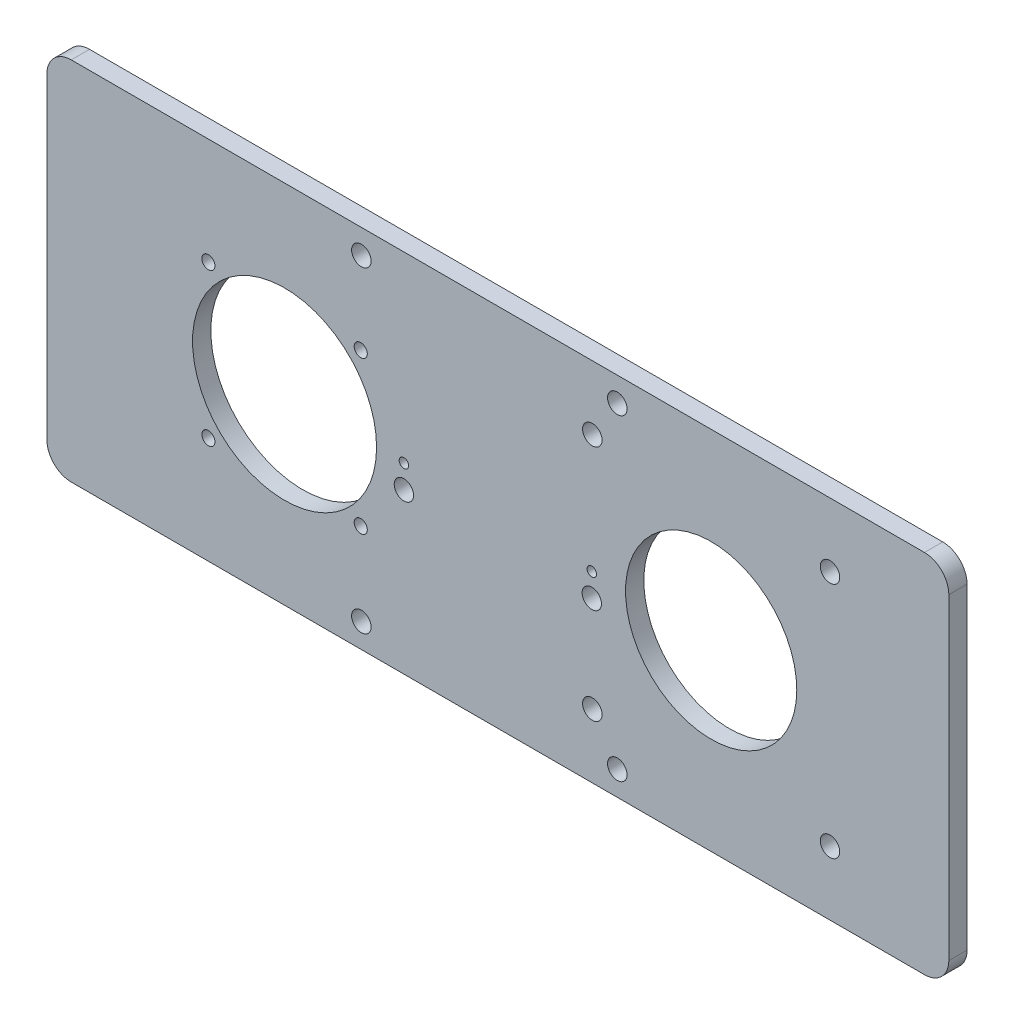
ISO-10303-21;
HEADER;
FILE_DESCRIPTION(('STEP AP214'),'2;1');
FILE_NAME('part.step','',(''),(''),'','','');
FILE_SCHEMA(('AUTOMOTIVE_DESIGN { 1 0 10303 214 1 1 1 1 }'));
ENDSEC;
DATA;
#1=APPLICATION_CONTEXT('core data for automotive mechanical design processes');
#2=APPLICATION_PROTOCOL_DEFINITION('international standard','automotive_design',2000,#1);
#3=PRODUCT_CONTEXT('',#1,'mechanical');
#4=PRODUCT('Part','Part','',(#3));
#5=PRODUCT_RELATED_PRODUCT_CATEGORY('part','',(#4));
#6=PRODUCT_DEFINITION_FORMATION('','',#4);
#7=PRODUCT_DEFINITION_CONTEXT('part definition',#1,'design');
#8=PRODUCT_DEFINITION('design','',#6,#7);
#9=PRODUCT_DEFINITION_SHAPE('','',#8);
#10=(LENGTH_UNIT() NAMED_UNIT(*) SI_UNIT(.MILLI.,.METRE.));
#11=(NAMED_UNIT(*) PLANE_ANGLE_UNIT() SI_UNIT($,.RADIAN.));
#12=(NAMED_UNIT(*) SI_UNIT($,.STERADIAN.) SOLID_ANGLE_UNIT());
#13=UNCERTAINTY_MEASURE_WITH_UNIT(LENGTH_MEASURE(1.E-05),#10,'distance_accuracy_value','');
#14=(GEOMETRIC_REPRESENTATION_CONTEXT(3) GLOBAL_UNCERTAINTY_ASSIGNED_CONTEXT((#13)) GLOBAL_UNIT_ASSIGNED_CONTEXT((#10,
#11,#12)) REPRESENTATION_CONTEXT('',''));
#15=CARTESIAN_POINT('',(0.,0.,0.));
#16=DIRECTION('',(0.,0.,1.));
#17=DIRECTION('',(1.,0.,0.));
#18=AXIS2_PLACEMENT_3D('',#15,#16,#17);
#19=CARTESIAN_POINT('',(-74.,30.,-3.));
#20=DIRECTION('',(-1.,0.,0.));
#21=DIRECTION('',(0.,0.,1.));
#22=AXIS2_PLACEMENT_3D('',#19,#20,#21);
#23=PLANE('',#22);
#24=DIRECTION('',(0.,-1.,0.));
#25=VECTOR('',#24,1.);
#26=CARTESIAN_POINT('',(-74.,30.,-3.));
#27=LINE('',#26,#25);
#28=CARTESIAN_POINT('',(-74.,26.,-3.));
#29=VERTEX_POINT('',#28);
#30=CARTESIAN_POINT('',(-74.,-26.,-3.));
#31=VERTEX_POINT('',#30);
#32=EDGE_CURVE('E171',#29,#31,#27,.T.);
#33=ORIENTED_EDGE('',*,*,#32,.T.);
#34=DIRECTION('',(0.,0.,1.));
#35=VECTOR('',#34,1.);
#36=CARTESIAN_POINT('',(-74.,-26.,-3.));
#37=LINE('',#36,#35);
#38=CARTESIAN_POINT('',(-74.,-26.,0.));
#39=VERTEX_POINT('',#38);
#40=EDGE_CURVE('E126',#31,#39,#37,.T.);
#41=ORIENTED_EDGE('',*,*,#40,.T.);
#42=DIRECTION('',(0.,-1.,0.));
#43=VECTOR('',#42,1.);
#44=CARTESIAN_POINT('',(-74.,30.,0.));
#45=LINE('',#44,#43);
#46=CARTESIAN_POINT('',(-74.,26.,0.));
#47=VERTEX_POINT('',#46);
#48=EDGE_CURVE('E111',#47,#39,#45,.T.);
#49=ORIENTED_EDGE('',*,*,#48,.F.);
#50=DIRECTION('',(0.,0.,1.));
#51=VECTOR('',#50,1.);
#52=CARTESIAN_POINT('',(-74.,26.,-3.));
#53=LINE('',#52,#51);
#54=EDGE_CURVE('E123',#47,#29,#53,.F.);
#55=ORIENTED_EDGE('',*,*,#54,.T.);
#56=EDGE_LOOP('',(#33,#41,#49,#55));
#57=FACE_BOUND('',#56,.T.);
#58=ADVANCED_FACE('F41',(#57),#23,.T.);
#59=CARTESIAN_POINT('',(-74.,30.,-3.));
#60=DIRECTION('',(0.,1.,0.));
#61=DIRECTION('',(0.,0.,1.));
#62=AXIS2_PLACEMENT_3D('',#59,#60,#61);
#63=PLANE('',#62);
#64=DIRECTION('',(-1.,0.,0.));
#65=VECTOR('',#64,1.);
#66=CARTESIAN_POINT('',(-74.,30.,-3.));
#67=LINE('',#66,#65);
#68=CARTESIAN_POINT('',(70.,30.,-3.));
#69=VERTEX_POINT('',#68);
#70=CARTESIAN_POINT('',(-70.,30.,-3.));
#71=VERTEX_POINT('',#70);
#72=EDGE_CURVE('E133',#69,#71,#67,.T.);
#73=ORIENTED_EDGE('',*,*,#72,.T.);
#74=DIRECTION('',(0.,0.,1.));
#75=VECTOR('',#74,1.);
#76=CARTESIAN_POINT('',(-70.,30.,-3.));
#77=LINE('',#76,#75);
#78=CARTESIAN_POINT('',(-70.,30.,0.));
#79=VERTEX_POINT('',#78);
#80=EDGE_CURVE('E11',#71,#79,#77,.T.);
#81=ORIENTED_EDGE('',*,*,#80,.T.);
#82=DIRECTION('',(-1.,0.,0.));
#83=VECTOR('',#82,1.);
#84=CARTESIAN_POINT('',(-74.,30.,0.));
#85=LINE('',#84,#83);
#86=CARTESIAN_POINT('',(70.,30.,0.));
#87=VERTEX_POINT('',#86);
#88=EDGE_CURVE('E113',#87,#79,#85,.T.);
#89=ORIENTED_EDGE('',*,*,#88,.F.);
#90=DIRECTION('',(0.,0.,1.));
#91=VECTOR('',#90,1.);
#92=CARTESIAN_POINT('',(70.,30.,-3.));
#93=LINE('',#92,#91);
#94=EDGE_CURVE('E49',#87,#69,#93,.F.);
#95=ORIENTED_EDGE('',*,*,#94,.T.);
#96=EDGE_LOOP('',(#73,#81,#89,#95));
#97=FACE_BOUND('',#96,.T.);
#98=ADVANCED_FACE('F162',(#97),#63,.T.);
#99=CARTESIAN_POINT('',(74.,-30.,-3.));
#100=DIRECTION('',(1.,0.,0.));
#101=DIRECTION('',(0.,0.,-1.));
#102=AXIS2_PLACEMENT_3D('',#99,#100,#101);
#103=PLANE('',#102);
#104=DIRECTION('',(0.,1.,0.));
#105=VECTOR('',#104,1.);
#106=CARTESIAN_POINT('',(74.,-30.,0.));
#107=LINE('',#106,#105);
#108=CARTESIAN_POINT('',(74.,-26.,0.));
#109=VERTEX_POINT('',#108);
#110=CARTESIAN_POINT('',(74.,26.,0.));
#111=VERTEX_POINT('',#110);
#112=EDGE_CURVE('E169',#109,#111,#107,.T.);
#113=ORIENTED_EDGE('',*,*,#112,.F.);
#114=DIRECTION('',(0.,0.,1.));
#115=VECTOR('',#114,1.);
#116=CARTESIAN_POINT('',(74.,-26.,-3.));
#117=LINE('',#116,#115);
#118=CARTESIAN_POINT('',(74.,-26.,-3.));
#119=VERTEX_POINT('',#118);
#120=EDGE_CURVE('E63',#109,#119,#117,.F.);
#121=ORIENTED_EDGE('',*,*,#120,.T.);
#122=DIRECTION('',(0.,1.,0.));
#123=VECTOR('',#122,1.);
#124=CARTESIAN_POINT('',(74.,-30.,-3.));
#125=LINE('',#124,#123);
#126=CARTESIAN_POINT('',(74.,26.,-3.));
#127=VERTEX_POINT('',#126);
#128=EDGE_CURVE('E137',#119,#127,#125,.T.);
#129=ORIENTED_EDGE('',*,*,#128,.T.);
#130=DIRECTION('',(0.,0.,1.));
#131=VECTOR('',#130,1.);
#132=CARTESIAN_POINT('',(74.,26.,-3.));
#133=LINE('',#132,#131);
#134=EDGE_CURVE('E157',#127,#111,#133,.T.);
#135=ORIENTED_EDGE('',*,*,#134,.T.);
#136=EDGE_LOOP('',(#113,#121,#129,#135));
#137=FACE_BOUND('',#136,.T.);
#138=ADVANCED_FACE('F168',(#137),#103,.T.);
#139=CARTESIAN_POINT('',(-74.,-30.,-3.));
#140=DIRECTION('',(0.,-1.,0.));
#141=DIRECTION('',(0.,0.,-1.));
#142=AXIS2_PLACEMENT_3D('',#139,#140,#141);
#143=PLANE('',#142);
#144=DIRECTION('',(1.,0.,0.));
#145=VECTOR('',#144,1.);
#146=CARTESIAN_POINT('',(-74.,-30.,0.));
#147=LINE('',#146,#145);
#148=CARTESIAN_POINT('',(-70.,-30.,0.));
#149=VERTEX_POINT('',#148);
#150=CARTESIAN_POINT('',(70.,-30.,0.));
#151=VERTEX_POINT('',#150);
#152=EDGE_CURVE('E127',#149,#151,#147,.T.);
#153=ORIENTED_EDGE('',*,*,#152,.F.);
#154=DIRECTION('',(0.,0.,1.));
#155=VECTOR('',#154,1.);
#156=CARTESIAN_POINT('',(-70.,-30.,-3.));
#157=LINE('',#156,#155);
#158=CARTESIAN_POINT('',(-70.,-30.,-3.));
#159=VERTEX_POINT('',#158);
#160=EDGE_CURVE('E149',#149,#159,#157,.F.);
#161=ORIENTED_EDGE('',*,*,#160,.T.);
#162=DIRECTION('',(1.,0.,0.));
#163=VECTOR('',#162,1.);
#164=CARTESIAN_POINT('',(-74.,-30.,-3.));
#165=LINE('',#164,#163);
#166=CARTESIAN_POINT('',(70.,-30.,-3.));
#167=VERTEX_POINT('',#166);
#168=EDGE_CURVE('E175',#159,#167,#165,.T.);
#169=ORIENTED_EDGE('',*,*,#168,.T.);
#170=DIRECTION('',(0.,0.,1.));
#171=VECTOR('',#170,1.);
#172=CARTESIAN_POINT('',(70.,-30.,-3.));
#173=LINE('',#172,#171);
#174=EDGE_CURVE('E146',#167,#151,#173,.T.);
#175=ORIENTED_EDGE('',*,*,#174,.T.);
#176=EDGE_LOOP('',(#153,#161,#169,#175));
#177=FACE_BOUND('',#176,.T.);
#178=ADVANCED_FACE('F347',(#177),#143,.T.);
#179=CARTESIAN_POINT('',(0.,0.,-3.));
#180=DIRECTION('',(0.,0.,1.));
#181=DIRECTION('',(1.,0.,0.));
#182=AXIS2_PLACEMENT_3D('',#179,#180,#181);
#183=PLANE('',#182);
#184=CARTESIAN_POINT('',(-22.4,26.,-3.));
#185=DIRECTION('',(0.,0.,1.));
#186=DIRECTION('',(1.,0.,0.));
#187=AXIS2_PLACEMENT_3D('',#184,#185,#186);
#188=CIRCLE('',#187,1.6);
#189=CARTESIAN_POINT('',(-20.8,26.,-3.));
#190=VERTEX_POINT('',#189);
#191=EDGE_CURVE('E280',#190,#190,#188,.T.);
#192=ORIENTED_EDGE('',*,*,#191,.T.);
#193=EDGE_LOOP('',(#192));
#194=FACE_BOUND('',#193,.T.);
#195=CARTESIAN_POINT('',(19.5999999999999,26.,-3.));
#196=DIRECTION('',(0.,0.,1.));
#197=DIRECTION('',(1.,0.,0.));
#198=AXIS2_PLACEMENT_3D('',#195,#196,#197);
#199=CIRCLE('',#198,1.6);
#200=CARTESIAN_POINT('',(21.1999999999999,26.,-3.));
#201=VERTEX_POINT('',#200);
#202=EDGE_CURVE('E274',#201,#201,#199,.T.);
#203=ORIENTED_EDGE('',*,*,#202,.T.);
#204=EDGE_LOOP('',(#203));
#205=FACE_BOUND('',#204,.T.);
#206=CARTESIAN_POINT('',(19.5999999999999,-26.,-3.));
#207=DIRECTION('',(0.,0.,1.));
#208=DIRECTION('',(1.,0.,0.));
#209=AXIS2_PLACEMENT_3D('',#206,#207,#208);
#210=CIRCLE('',#209,1.6);
#211=CARTESIAN_POINT('',(21.1999999999999,-26.,-3.));
#212=VERTEX_POINT('',#211);
#213=EDGE_CURVE('E268',#212,#212,#210,.T.);
#214=ORIENTED_EDGE('',*,*,#213,.T.);
#215=EDGE_LOOP('',(#214));
#216=FACE_BOUND('',#215,.T.);
#217=CARTESIAN_POINT('',(-22.4,-26.,-3.));
#218=DIRECTION('',(0.,0.,1.));
#219=DIRECTION('',(1.,0.,0.));
#220=AXIS2_PLACEMENT_3D('',#217,#218,#219);
#221=CIRCLE('',#220,1.6);
#222=CARTESIAN_POINT('',(-20.8,-26.,-3.));
#223=VERTEX_POINT('',#222);
#224=EDGE_CURVE('E262',#223,#223,#221,.T.);
#225=ORIENTED_EDGE('',*,*,#224,.T.);
#226=EDGE_LOOP('',(#225));
#227=FACE_BOUND('',#226,.T.);
#228=CARTESIAN_POINT('',(-15.42,0.,-3.));
#229=DIRECTION('',(0.,0.,1.));
#230=DIRECTION('',(1.,0.,0.));
#231=AXIS2_PLACEMENT_3D('',#228,#229,#230);
#232=CIRCLE('',#231,0.775);
#233=CARTESIAN_POINT('',(-14.645,0.,-3.));
#234=VERTEX_POINT('',#233);
#235=EDGE_CURVE('E256',#234,#234,#232,.T.);
#236=ORIENTED_EDGE('',*,*,#235,.T.);
#237=EDGE_LOOP('',(#236));
#238=FACE_BOUND('',#237,.T.);
#239=CARTESIAN_POINT('',(15.4159,0.,-3.));
#240=DIRECTION('',(0.,0.,1.));
#241=DIRECTION('',(1.,0.,0.));
#242=AXIS2_PLACEMENT_3D('',#239,#240,#241);
#243=CIRCLE('',#242,0.774999999999998);
#244=CARTESIAN_POINT('',(16.1909,0.,-3.));
#245=VERTEX_POINT('',#244);
#246=EDGE_CURVE('E250',#245,#245,#243,.T.);
#247=ORIENTED_EDGE('',*,*,#246,.T.);
#248=EDGE_LOOP('',(#247));
#249=FACE_BOUND('',#248,.T.);
#250=CARTESIAN_POINT('',(-15.42,-3.81,-3.));
#251=DIRECTION('',(0.,0.,1.));
#252=DIRECTION('',(1.,0.,0.));
#253=AXIS2_PLACEMENT_3D('',#250,#251,#252);
#254=CIRCLE('',#253,1.5875);
#255=CARTESIAN_POINT('',(-13.8325,-3.81,-3.));
#256=VERTEX_POINT('',#255);
#257=EDGE_CURVE('E244',#256,#256,#254,.T.);
#258=ORIENTED_EDGE('',*,*,#257,.T.);
#259=EDGE_LOOP('',(#258));
#260=FACE_BOUND('',#259,.T.);
#261=CARTESIAN_POINT('',(15.4159,-3.81,-3.));
#262=DIRECTION('',(0.,0.,1.));
#263=DIRECTION('',(1.,0.,0.));
#264=AXIS2_PLACEMENT_3D('',#261,#262,#263);
#265=CIRCLE('',#264,1.5875);
#266=CARTESIAN_POINT('',(17.0034,-3.81,-3.));
#267=VERTEX_POINT('',#266);
#268=EDGE_CURVE('E238',#267,#267,#265,.T.);
#269=ORIENTED_EDGE('',*,*,#268,.T.);
#270=EDGE_LOOP('',(#269));
#271=FACE_BOUND('',#270,.T.);
#272=CARTESIAN_POINT('',(15.5,19.5,-3.));
#273=DIRECTION('',(0.,0.,1.));
#274=DIRECTION('',(1.,0.,0.));
#275=AXIS2_PLACEMENT_3D('',#272,#273,#274);
#276=CIRCLE('',#275,1.6);
#277=CARTESIAN_POINT('',(17.1,19.5,-3.));
#278=VERTEX_POINT('',#277);
#279=EDGE_CURVE('E232',#278,#278,#276,.T.);
#280=ORIENTED_EDGE('',*,*,#279,.T.);
#281=EDGE_LOOP('',(#280));
#282=FACE_BOUND('',#281,.T.);
#283=CARTESIAN_POINT('',(54.5,19.5,-3.));
#284=DIRECTION('',(0.,0.,1.));
#285=DIRECTION('',(1.,0.,0.));
#286=AXIS2_PLACEMENT_3D('',#283,#284,#285);
#287=CIRCLE('',#286,1.6);
#288=CARTESIAN_POINT('',(56.1,19.5,-3.));
#289=VERTEX_POINT('',#288);
#290=EDGE_CURVE('E226',#289,#289,#287,.T.);
#291=ORIENTED_EDGE('',*,*,#290,.T.);
#292=EDGE_LOOP('',(#291));
#293=FACE_BOUND('',#292,.T.);
#294=CARTESIAN_POINT('',(54.5,-19.5,-3.));
#295=DIRECTION('',(0.,0.,1.));
#296=DIRECTION('',(1.,0.,0.));
#297=AXIS2_PLACEMENT_3D('',#294,#295,#296);
#298=CIRCLE('',#297,1.6);
#299=CARTESIAN_POINT('',(56.1,-19.5,-3.));
#300=VERTEX_POINT('',#299);
#301=EDGE_CURVE('E220',#300,#300,#298,.T.);
#302=ORIENTED_EDGE('',*,*,#301,.T.);
#303=EDGE_LOOP('',(#302));
#304=FACE_BOUND('',#303,.T.);
#305=CARTESIAN_POINT('',(15.5,-19.5,-3.));
#306=DIRECTION('',(0.,0.,1.));
#307=DIRECTION('',(1.,0.,0.));
#308=AXIS2_PLACEMENT_3D('',#305,#306,#307);
#309=CIRCLE('',#308,1.6);
#310=CARTESIAN_POINT('',(17.1,-19.5,-3.));
#311=VERTEX_POINT('',#310);
#312=EDGE_CURVE('E214',#311,#311,#309,.T.);
#313=ORIENTED_EDGE('',*,*,#312,.T.);
#314=EDGE_LOOP('',(#313));
#315=FACE_BOUND('',#314,.T.);
#316=CARTESIAN_POINT('',(-47.5,12.5,-3.));
#317=DIRECTION('',(0.,0.,1.));
#318=DIRECTION('',(1.,0.,0.));
#319=AXIS2_PLACEMENT_3D('',#316,#317,#318);
#320=CIRCLE('',#319,1.075);
#321=CARTESIAN_POINT('',(-46.425,12.5,-3.));
#322=VERTEX_POINT('',#321);
#323=EDGE_CURVE('E208',#322,#322,#320,.T.);
#324=ORIENTED_EDGE('',*,*,#323,.T.);
#325=EDGE_LOOP('',(#324));
#326=FACE_BOUND('',#325,.T.);
#327=CARTESIAN_POINT('',(-22.5,12.5,-3.));
#328=DIRECTION('',(0.,0.,1.));
#329=DIRECTION('',(1.,0.,0.));
#330=AXIS2_PLACEMENT_3D('',#327,#328,#329);
#331=CIRCLE('',#330,1.075);
#332=CARTESIAN_POINT('',(-21.425,12.5,-3.));
#333=VERTEX_POINT('',#332);
#334=EDGE_CURVE('E202',#333,#333,#331,.T.);
#335=ORIENTED_EDGE('',*,*,#334,.T.);
#336=EDGE_LOOP('',(#335));
#337=FACE_BOUND('',#336,.T.);
#338=CARTESIAN_POINT('',(-22.5,-12.5,-3.));
#339=DIRECTION('',(0.,0.,1.));
#340=DIRECTION('',(1.,0.,0.));
#341=AXIS2_PLACEMENT_3D('',#338,#339,#340);
#342=CIRCLE('',#341,1.075);
#343=CARTESIAN_POINT('',(-21.425,-12.5,-3.));
#344=VERTEX_POINT('',#343);
#345=EDGE_CURVE('E196',#344,#344,#342,.T.);
#346=ORIENTED_EDGE('',*,*,#345,.T.);
#347=EDGE_LOOP('',(#346));
#348=FACE_BOUND('',#347,.T.);
#349=CARTESIAN_POINT('',(-47.5,-12.5,-3.));
#350=DIRECTION('',(0.,0.,1.));
#351=DIRECTION('',(1.,0.,0.));
#352=AXIS2_PLACEMENT_3D('',#349,#350,#351);
#353=CIRCLE('',#352,1.075);
#354=CARTESIAN_POINT('',(-46.425,-12.5,-3.));
#355=VERTEX_POINT('',#354);
#356=EDGE_CURVE('E188',#355,#355,#353,.T.);
#357=ORIENTED_EDGE('',*,*,#356,.T.);
#358=EDGE_LOOP('',(#357));
#359=FACE_BOUND('',#358,.T.);
#360=CARTESIAN_POINT('',(-35.,0.,-3.));
#361=DIRECTION('',(0.,0.,1.));
#362=DIRECTION('',(1.,0.,0.));
#363=AXIS2_PLACEMENT_3D('',#360,#361,#362);
#364=CIRCLE('',#363,15.1);
#365=CARTESIAN_POINT('',(-19.9,0.,-3.));
#366=VERTEX_POINT('',#365);
#367=EDGE_CURVE('E182',#366,#366,#364,.T.);
#368=ORIENTED_EDGE('',*,*,#367,.T.);
#369=EDGE_LOOP('',(#368));
#370=FACE_BOUND('',#369,.T.);
#371=CARTESIAN_POINT('',(35.,0.,-3.));
#372=DIRECTION('',(0.,0.,1.));
#373=DIRECTION('',(1.,0.,0.));
#374=AXIS2_PLACEMENT_3D('',#371,#372,#373);
#375=CIRCLE('',#374,14.05);
#376=CARTESIAN_POINT('',(49.05,0.,-3.));
#377=VERTEX_POINT('',#376);
#378=EDGE_CURVE('E128',#377,#377,#375,.T.);
#379=ORIENTED_EDGE('',*,*,#378,.T.);
#380=EDGE_LOOP('',(#379));
#381=FACE_BOUND('',#380,.T.);
#382=ORIENTED_EDGE('',*,*,#168,.F.);
#383=CARTESIAN_POINT('',(-70.,-26.,-3.));
#384=DIRECTION('',(0.,0.,1.));
#385=DIRECTION('',(1.,0.,0.));
#386=AXIS2_PLACEMENT_3D('',#383,#384,#385);
#387=CIRCLE('',#386,4.);
#388=EDGE_CURVE('E155',#159,#31,#387,.F.);
#389=ORIENTED_EDGE('',*,*,#388,.T.);
#390=ORIENTED_EDGE('',*,*,#32,.F.);
#391=CARTESIAN_POINT('',(-70.,26.,-3.));
#392=DIRECTION('',(0.,0.,1.));
#393=DIRECTION('',(1.,0.,0.));
#394=AXIS2_PLACEMENT_3D('',#391,#392,#393);
#395=CIRCLE('',#394,4.);
#396=EDGE_CURVE('E132',#29,#71,#395,.F.);
#397=ORIENTED_EDGE('',*,*,#396,.T.);
#398=ORIENTED_EDGE('',*,*,#72,.F.);
#399=CARTESIAN_POINT('',(70.,26.,-3.));
#400=DIRECTION('',(0.,0.,1.));
#401=DIRECTION('',(1.,0.,0.));
#402=AXIS2_PLACEMENT_3D('',#399,#400,#401);
#403=CIRCLE('',#402,4.);
#404=EDGE_CURVE('E56',#69,#127,#403,.F.);
#405=ORIENTED_EDGE('',*,*,#404,.T.);
#406=ORIENTED_EDGE('',*,*,#128,.F.);
#407=CARTESIAN_POINT('',(70.,-26.,-3.));
#408=DIRECTION('',(0.,0.,1.));
#409=DIRECTION('',(1.,0.,0.));
#410=AXIS2_PLACEMENT_3D('',#407,#408,#409);
#411=CIRCLE('',#410,4.);
#412=EDGE_CURVE('E153',#119,#167,#411,.F.);
#413=ORIENTED_EDGE('',*,*,#412,.T.);
#414=EDGE_LOOP('',(#382,#389,#390,#397,#398,#405,#406,#413));
#415=FACE_BOUND('',#414,.T.);
#416=ADVANCED_FACE('F165',(#194,#205,#216,#227,#238,#249,#260,#271,#282,#293,#304,#315,#326,
#337,#348,#359,#370,#381,#415),#183,.F.);
#417=CARTESIAN_POINT('',(0.,0.,0.));
#418=DIRECTION('',(0.,0.,1.));
#419=DIRECTION('',(1.,0.,0.));
#420=AXIS2_PLACEMENT_3D('',#417,#418,#419);
#421=PLANE('',#420);
#422=CARTESIAN_POINT('',(-22.4,26.,0.));
#423=DIRECTION('',(0.,0.,1.));
#424=DIRECTION('',(1.,0.,0.));
#425=AXIS2_PLACEMENT_3D('',#422,#423,#424);
#426=CIRCLE('',#425,1.6);
#427=CARTESIAN_POINT('',(-20.8,26.,0.));
#428=VERTEX_POINT('',#427);
#429=EDGE_CURVE('E283',#428,#428,#426,.T.);
#430=ORIENTED_EDGE('',*,*,#429,.F.);
#431=EDGE_LOOP('',(#430));
#432=FACE_BOUND('',#431,.T.);
#433=CARTESIAN_POINT('',(19.5999999999999,26.,0.));
#434=DIRECTION('',(0.,0.,1.));
#435=DIRECTION('',(1.,0.,0.));
#436=AXIS2_PLACEMENT_3D('',#433,#434,#435);
#437=CIRCLE('',#436,1.6);
#438=CARTESIAN_POINT('',(21.1999999999999,26.,0.));
#439=VERTEX_POINT('',#438);
#440=EDGE_CURVE('E277',#439,#439,#437,.T.);
#441=ORIENTED_EDGE('',*,*,#440,.F.);
#442=EDGE_LOOP('',(#441));
#443=FACE_BOUND('',#442,.T.);
#444=CARTESIAN_POINT('',(19.5999999999999,-26.,0.));
#445=DIRECTION('',(0.,0.,1.));
#446=DIRECTION('',(1.,0.,0.));
#447=AXIS2_PLACEMENT_3D('',#444,#445,#446);
#448=CIRCLE('',#447,1.6);
#449=CARTESIAN_POINT('',(21.1999999999999,-26.,0.));
#450=VERTEX_POINT('',#449);
#451=EDGE_CURVE('E271',#450,#450,#448,.T.);
#452=ORIENTED_EDGE('',*,*,#451,.F.);
#453=EDGE_LOOP('',(#452));
#454=FACE_BOUND('',#453,.T.);
#455=CARTESIAN_POINT('',(-22.4,-26.,0.));
#456=DIRECTION('',(0.,0.,1.));
#457=DIRECTION('',(1.,0.,0.));
#458=AXIS2_PLACEMENT_3D('',#455,#456,#457);
#459=CIRCLE('',#458,1.6);
#460=CARTESIAN_POINT('',(-20.8,-26.,0.));
#461=VERTEX_POINT('',#460);
#462=EDGE_CURVE('E265',#461,#461,#459,.T.);
#463=ORIENTED_EDGE('',*,*,#462,.F.);
#464=EDGE_LOOP('',(#463));
#465=FACE_BOUND('',#464,.T.);
#466=CARTESIAN_POINT('',(-15.42,0.,0.));
#467=DIRECTION('',(0.,0.,1.));
#468=DIRECTION('',(1.,0.,0.));
#469=AXIS2_PLACEMENT_3D('',#466,#467,#468);
#470=CIRCLE('',#469,0.775);
#471=CARTESIAN_POINT('',(-14.645,0.,0.));
#472=VERTEX_POINT('',#471);
#473=EDGE_CURVE('E259',#472,#472,#470,.T.);
#474=ORIENTED_EDGE('',*,*,#473,.F.);
#475=EDGE_LOOP('',(#474));
#476=FACE_BOUND('',#475,.T.);
#477=CARTESIAN_POINT('',(15.4159,0.,0.));
#478=DIRECTION('',(0.,0.,1.));
#479=DIRECTION('',(1.,0.,0.));
#480=AXIS2_PLACEMENT_3D('',#477,#478,#479);
#481=CIRCLE('',#480,0.774999999999998);
#482=CARTESIAN_POINT('',(16.1909,0.,0.));
#483=VERTEX_POINT('',#482);
#484=EDGE_CURVE('E253',#483,#483,#481,.T.);
#485=ORIENTED_EDGE('',*,*,#484,.F.);
#486=EDGE_LOOP('',(#485));
#487=FACE_BOUND('',#486,.T.);
#488=CARTESIAN_POINT('',(-15.42,-3.81,0.));
#489=DIRECTION('',(0.,0.,1.));
#490=DIRECTION('',(1.,0.,0.));
#491=AXIS2_PLACEMENT_3D('',#488,#489,#490);
#492=CIRCLE('',#491,1.5875);
#493=CARTESIAN_POINT('',(-13.8325,-3.81,0.));
#494=VERTEX_POINT('',#493);
#495=EDGE_CURVE('E247',#494,#494,#492,.T.);
#496=ORIENTED_EDGE('',*,*,#495,.F.);
#497=EDGE_LOOP('',(#496));
#498=FACE_BOUND('',#497,.T.);
#499=CARTESIAN_POINT('',(15.4159,-3.81,0.));
#500=DIRECTION('',(0.,0.,1.));
#501=DIRECTION('',(1.,0.,0.));
#502=AXIS2_PLACEMENT_3D('',#499,#500,#501);
#503=CIRCLE('',#502,1.5875);
#504=CARTESIAN_POINT('',(17.0034,-3.81,0.));
#505=VERTEX_POINT('',#504);
#506=EDGE_CURVE('E241',#505,#505,#503,.T.);
#507=ORIENTED_EDGE('',*,*,#506,.F.);
#508=EDGE_LOOP('',(#507));
#509=FACE_BOUND('',#508,.T.);
#510=CARTESIAN_POINT('',(15.5,19.5,0.));
#511=DIRECTION('',(0.,0.,1.));
#512=DIRECTION('',(1.,0.,0.));
#513=AXIS2_PLACEMENT_3D('',#510,#511,#512);
#514=CIRCLE('',#513,1.6);
#515=CARTESIAN_POINT('',(17.1,19.5,0.));
#516=VERTEX_POINT('',#515);
#517=EDGE_CURVE('E235',#516,#516,#514,.T.);
#518=ORIENTED_EDGE('',*,*,#517,.F.);
#519=EDGE_LOOP('',(#518));
#520=FACE_BOUND('',#519,.T.);
#521=CARTESIAN_POINT('',(54.5,19.5,0.));
#522=DIRECTION('',(0.,0.,1.));
#523=DIRECTION('',(1.,0.,0.));
#524=AXIS2_PLACEMENT_3D('',#521,#522,#523);
#525=CIRCLE('',#524,1.6);
#526=CARTESIAN_POINT('',(56.1,19.5,0.));
#527=VERTEX_POINT('',#526);
#528=EDGE_CURVE('E229',#527,#527,#525,.T.);
#529=ORIENTED_EDGE('',*,*,#528,.F.);
#530=EDGE_LOOP('',(#529));
#531=FACE_BOUND('',#530,.T.);
#532=CARTESIAN_POINT('',(54.5,-19.5,0.));
#533=DIRECTION('',(0.,0.,1.));
#534=DIRECTION('',(1.,0.,0.));
#535=AXIS2_PLACEMENT_3D('',#532,#533,#534);
#536=CIRCLE('',#535,1.6);
#537=CARTESIAN_POINT('',(56.1,-19.5,0.));
#538=VERTEX_POINT('',#537);
#539=EDGE_CURVE('E223',#538,#538,#536,.T.);
#540=ORIENTED_EDGE('',*,*,#539,.F.);
#541=EDGE_LOOP('',(#540));
#542=FACE_BOUND('',#541,.T.);
#543=CARTESIAN_POINT('',(15.5,-19.5,0.));
#544=DIRECTION('',(0.,0.,1.));
#545=DIRECTION('',(1.,0.,0.));
#546=AXIS2_PLACEMENT_3D('',#543,#544,#545);
#547=CIRCLE('',#546,1.6);
#548=CARTESIAN_POINT('',(17.1,-19.5,0.));
#549=VERTEX_POINT('',#548);
#550=EDGE_CURVE('E217',#549,#549,#547,.T.);
#551=ORIENTED_EDGE('',*,*,#550,.F.);
#552=EDGE_LOOP('',(#551));
#553=FACE_BOUND('',#552,.T.);
#554=CARTESIAN_POINT('',(-47.5,12.5,0.));
#555=DIRECTION('',(0.,0.,1.));
#556=DIRECTION('',(1.,0.,0.));
#557=AXIS2_PLACEMENT_3D('',#554,#555,#556);
#558=CIRCLE('',#557,1.075);
#559=CARTESIAN_POINT('',(-46.425,12.5,0.));
#560=VERTEX_POINT('',#559);
#561=EDGE_CURVE('E211',#560,#560,#558,.T.);
#562=ORIENTED_EDGE('',*,*,#561,.F.);
#563=EDGE_LOOP('',(#562));
#564=FACE_BOUND('',#563,.T.);
#565=CARTESIAN_POINT('',(-22.5,12.5,0.));
#566=DIRECTION('',(0.,0.,1.));
#567=DIRECTION('',(1.,0.,0.));
#568=AXIS2_PLACEMENT_3D('',#565,#566,#567);
#569=CIRCLE('',#568,1.075);
#570=CARTESIAN_POINT('',(-21.425,12.5,0.));
#571=VERTEX_POINT('',#570);
#572=EDGE_CURVE('E205',#571,#571,#569,.T.);
#573=ORIENTED_EDGE('',*,*,#572,.F.);
#574=EDGE_LOOP('',(#573));
#575=FACE_BOUND('',#574,.T.);
#576=CARTESIAN_POINT('',(-22.5,-12.5,0.));
#577=DIRECTION('',(0.,0.,1.));
#578=DIRECTION('',(1.,0.,0.));
#579=AXIS2_PLACEMENT_3D('',#576,#577,#578);
#580=CIRCLE('',#579,1.075);
#581=CARTESIAN_POINT('',(-21.425,-12.5,0.));
#582=VERTEX_POINT('',#581);
#583=EDGE_CURVE('E199',#582,#582,#580,.T.);
#584=ORIENTED_EDGE('',*,*,#583,.F.);
#585=EDGE_LOOP('',(#584));
#586=FACE_BOUND('',#585,.T.);
#587=CARTESIAN_POINT('',(-47.5,-12.5,0.));
#588=DIRECTION('',(0.,0.,1.));
#589=DIRECTION('',(1.,0.,0.));
#590=AXIS2_PLACEMENT_3D('',#587,#588,#589);
#591=CIRCLE('',#590,1.075);
#592=CARTESIAN_POINT('',(-46.425,-12.5,0.));
#593=VERTEX_POINT('',#592);
#594=EDGE_CURVE('E193',#593,#593,#591,.T.);
#595=ORIENTED_EDGE('',*,*,#594,.F.);
#596=EDGE_LOOP('',(#595));
#597=FACE_BOUND('',#596,.T.);
#598=CARTESIAN_POINT('',(-35.,0.,0.));
#599=DIRECTION('',(0.,0.,1.));
#600=DIRECTION('',(1.,0.,0.));
#601=AXIS2_PLACEMENT_3D('',#598,#599,#600);
#602=CIRCLE('',#601,15.1);
#603=CARTESIAN_POINT('',(-19.9,0.,0.));
#604=VERTEX_POINT('',#603);
#605=EDGE_CURVE('E185',#604,#604,#602,.T.);
#606=ORIENTED_EDGE('',*,*,#605,.F.);
#607=EDGE_LOOP('',(#606));
#608=FACE_BOUND('',#607,.T.);
#609=CARTESIAN_POINT('',(35.,0.,0.));
#610=DIRECTION('',(0.,0.,1.));
#611=DIRECTION('',(1.,0.,0.));
#612=AXIS2_PLACEMENT_3D('',#609,#610,#611);
#613=CIRCLE('',#612,14.05);
#614=CARTESIAN_POINT('',(49.05,0.,0.));
#615=VERTEX_POINT('',#614);
#616=EDGE_CURVE('E179',#615,#615,#613,.T.);
#617=ORIENTED_EDGE('',*,*,#616,.F.);
#618=EDGE_LOOP('',(#617));
#619=FACE_BOUND('',#618,.T.);
#620=ORIENTED_EDGE('',*,*,#48,.T.);
#621=CARTESIAN_POINT('',(-70.,-26.,0.));
#622=DIRECTION('',(0.,0.,1.));
#623=DIRECTION('',(1.,0.,0.));
#624=AXIS2_PLACEMENT_3D('',#621,#622,#623);
#625=CIRCLE('',#624,4.);
#626=EDGE_CURVE('E144',#39,#149,#625,.T.);
#627=ORIENTED_EDGE('',*,*,#626,.T.);
#628=ORIENTED_EDGE('',*,*,#152,.T.);
#629=CARTESIAN_POINT('',(70.,-26.,0.));
#630=DIRECTION('',(0.,0.,1.));
#631=DIRECTION('',(1.,0.,0.));
#632=AXIS2_PLACEMENT_3D('',#629,#630,#631);
#633=CIRCLE('',#632,4.);
#634=EDGE_CURVE('E117',#151,#109,#633,.T.);
#635=ORIENTED_EDGE('',*,*,#634,.T.);
#636=ORIENTED_EDGE('',*,*,#112,.T.);
#637=CARTESIAN_POINT('',(70.,26.,0.));
#638=DIRECTION('',(0.,0.,1.));
#639=DIRECTION('',(1.,0.,0.));
#640=AXIS2_PLACEMENT_3D('',#637,#638,#639);
#641=CIRCLE('',#640,4.);
#642=EDGE_CURVE('E118',#111,#87,#641,.T.);
#643=ORIENTED_EDGE('',*,*,#642,.T.);
#644=ORIENTED_EDGE('',*,*,#88,.T.);
#645=CARTESIAN_POINT('',(-70.,26.,0.));
#646=DIRECTION('',(0.,0.,1.));
#647=DIRECTION('',(1.,0.,0.));
#648=AXIS2_PLACEMENT_3D('',#645,#646,#647);
#649=CIRCLE('',#648,4.);
#650=EDGE_CURVE('E108',#79,#47,#649,.T.);
#651=ORIENTED_EDGE('',*,*,#650,.T.);
#652=EDGE_LOOP('',(#620,#627,#628,#635,#636,#643,#644,#651));
#653=FACE_BOUND('',#652,.T.);
#654=ADVANCED_FACE('F110',(#432,#443,#454,#465,#476,#487,#498,#509,#520,#531,#542,#553,#564,
#575,#586,#597,#608,#619,#653),#421,.T.);
#655=CARTESIAN_POINT('',(35.,0.,-3.));
#656=DIRECTION('',(0.,0.,1.));
#657=DIRECTION('',(1.,0.,0.));
#658=AXIS2_PLACEMENT_3D('',#655,#656,#657);
#659=CYLINDRICAL_SURFACE('',#658,14.05);
#660=ORIENTED_EDGE('',*,*,#378,.F.);
#661=EDGE_LOOP('',(#660));
#662=FACE_BOUND('',#661,.T.);
#663=ORIENTED_EDGE('',*,*,#616,.T.);
#664=EDGE_LOOP('',(#663));
#665=FACE_BOUND('',#664,.T.);
#666=ADVANCED_FACE('F291',(#662,#665),#659,.F.);
#667=CARTESIAN_POINT('',(-35.,0.,-3.));
#668=DIRECTION('',(0.,0.,1.));
#669=DIRECTION('',(1.,0.,0.));
#670=AXIS2_PLACEMENT_3D('',#667,#668,#669);
#671=CYLINDRICAL_SURFACE('',#670,15.1);
#672=ORIENTED_EDGE('',*,*,#367,.F.);
#673=EDGE_LOOP('',(#672));
#674=FACE_BOUND('',#673,.T.);
#675=ORIENTED_EDGE('',*,*,#605,.T.);
#676=EDGE_LOOP('',(#675));
#677=FACE_BOUND('',#676,.T.);
#678=ADVANCED_FACE('F328',(#674,#677),#671,.F.);
#679=CARTESIAN_POINT('',(-70.,-26.,-3.));
#680=DIRECTION('',(0.,0.,1.));
#681=DIRECTION('',(1.,0.,0.));
#682=AXIS2_PLACEMENT_3D('',#679,#680,#681);
#683=CYLINDRICAL_SURFACE('',#682,4.);
#684=ORIENTED_EDGE('',*,*,#388,.F.);
#685=ORIENTED_EDGE('',*,*,#160,.F.);
#686=ORIENTED_EDGE('',*,*,#626,.F.);
#687=ORIENTED_EDGE('',*,*,#40,.F.);
#688=EDGE_LOOP('',(#684,#685,#686,#687));
#689=FACE_BOUND('',#688,.T.);
#690=ADVANCED_FACE('F334',(#689),#683,.T.);
#691=CARTESIAN_POINT('',(70.,-26.,-3.));
#692=DIRECTION('',(0.,0.,1.));
#693=DIRECTION('',(1.,0.,0.));
#694=AXIS2_PLACEMENT_3D('',#691,#692,#693);
#695=CYLINDRICAL_SURFACE('',#694,4.);
#696=ORIENTED_EDGE('',*,*,#412,.F.);
#697=ORIENTED_EDGE('',*,*,#120,.F.);
#698=ORIENTED_EDGE('',*,*,#634,.F.);
#699=ORIENTED_EDGE('',*,*,#174,.F.);
#700=EDGE_LOOP('',(#696,#697,#698,#699));
#701=FACE_BOUND('',#700,.T.);
#702=ADVANCED_FACE('F351',(#701),#695,.T.);
#703=CARTESIAN_POINT('',(-70.,26.,-3.));
#704=DIRECTION('',(0.,0.,1.));
#705=DIRECTION('',(1.,0.,0.));
#706=AXIS2_PLACEMENT_3D('',#703,#704,#705);
#707=CYLINDRICAL_SURFACE('',#706,4.);
#708=ORIENTED_EDGE('',*,*,#396,.F.);
#709=ORIENTED_EDGE('',*,*,#54,.F.);
#710=ORIENTED_EDGE('',*,*,#650,.F.);
#711=ORIENTED_EDGE('',*,*,#80,.F.);
#712=EDGE_LOOP('',(#708,#709,#710,#711));
#713=FACE_BOUND('',#712,.T.);
#714=ADVANCED_FACE('F131',(#713),#707,.T.);
#715=CARTESIAN_POINT('',(70.,26.,-3.));
#716=DIRECTION('',(0.,0.,1.));
#717=DIRECTION('',(1.,0.,0.));
#718=AXIS2_PLACEMENT_3D('',#715,#716,#717);
#719=CYLINDRICAL_SURFACE('',#718,4.);
#720=ORIENTED_EDGE('',*,*,#404,.F.);
#721=ORIENTED_EDGE('',*,*,#94,.F.);
#722=ORIENTED_EDGE('',*,*,#642,.F.);
#723=ORIENTED_EDGE('',*,*,#134,.F.);
#724=EDGE_LOOP('',(#720,#721,#722,#723));
#725=FACE_BOUND('',#724,.T.);
#726=ADVANCED_FACE('F43',(#725),#719,.T.);
#727=CARTESIAN_POINT('',(-47.5,-12.5,0.));
#728=DIRECTION('',(0.,0.,1.));
#729=DIRECTION('',(1.,0.,0.));
#730=AXIS2_PLACEMENT_3D('',#727,#728,#729);
#731=CYLINDRICAL_SURFACE('',#730,1.075);
#732=ORIENTED_EDGE('',*,*,#356,.F.);
#733=EDGE_LOOP('',(#732));
#734=FACE_BOUND('',#733,.T.);
#735=ORIENTED_EDGE('',*,*,#594,.T.);
#736=EDGE_LOOP('',(#735));
#737=FACE_BOUND('',#736,.T.);
#738=ADVANCED_FACE('F359',(#734,#737),#731,.F.);
#739=CARTESIAN_POINT('',(-22.5,-12.5,0.));
#740=DIRECTION('',(0.,0.,1.));
#741=DIRECTION('',(1.,0.,0.));
#742=AXIS2_PLACEMENT_3D('',#739,#740,#741);
#743=CYLINDRICAL_SURFACE('',#742,1.075);
#744=ORIENTED_EDGE('',*,*,#345,.F.);
#745=EDGE_LOOP('',(#744));
#746=FACE_BOUND('',#745,.T.);
#747=ORIENTED_EDGE('',*,*,#583,.T.);
#748=EDGE_LOOP('',(#747));
#749=FACE_BOUND('',#748,.T.);
#750=ADVANCED_FACE('F363',(#746,#749),#743,.F.);
#751=CARTESIAN_POINT('',(-22.5,12.5,0.));
#752=DIRECTION('',(0.,0.,1.));
#753=DIRECTION('',(1.,0.,0.));
#754=AXIS2_PLACEMENT_3D('',#751,#752,#753);
#755=CYLINDRICAL_SURFACE('',#754,1.075);
#756=ORIENTED_EDGE('',*,*,#334,.F.);
#757=EDGE_LOOP('',(#756));
#758=FACE_BOUND('',#757,.T.);
#759=ORIENTED_EDGE('',*,*,#572,.T.);
#760=EDGE_LOOP('',(#759));
#761=FACE_BOUND('',#760,.T.);
#762=ADVANCED_FACE('F369',(#758,#761),#755,.F.);
#763=CARTESIAN_POINT('',(-47.5,12.5,0.));
#764=DIRECTION('',(0.,0.,1.));
#765=DIRECTION('',(1.,0.,0.));
#766=AXIS2_PLACEMENT_3D('',#763,#764,#765);
#767=CYLINDRICAL_SURFACE('',#766,1.075);
#768=ORIENTED_EDGE('',*,*,#323,.F.);
#769=EDGE_LOOP('',(#768));
#770=FACE_BOUND('',#769,.T.);
#771=ORIENTED_EDGE('',*,*,#561,.T.);
#772=EDGE_LOOP('',(#771));
#773=FACE_BOUND('',#772,.T.);
#774=ADVANCED_FACE('F377',(#770,#773),#767,.F.);
#775=CARTESIAN_POINT('',(15.5,-19.5,0.));
#776=DIRECTION('',(0.,0.,1.));
#777=DIRECTION('',(1.,0.,0.));
#778=AXIS2_PLACEMENT_3D('',#775,#776,#777);
#779=CYLINDRICAL_SURFACE('',#778,1.6);
#780=ORIENTED_EDGE('',*,*,#312,.F.);
#781=EDGE_LOOP('',(#780));
#782=FACE_BOUND('',#781,.T.);
#783=ORIENTED_EDGE('',*,*,#550,.T.);
#784=EDGE_LOOP('',(#783));
#785=FACE_BOUND('',#784,.T.);
#786=ADVANCED_FACE('F381',(#782,#785),#779,.F.);
#787=CARTESIAN_POINT('',(54.5,-19.5,0.));
#788=DIRECTION('',(0.,0.,1.));
#789=DIRECTION('',(1.,0.,0.));
#790=AXIS2_PLACEMENT_3D('',#787,#788,#789);
#791=CYLINDRICAL_SURFACE('',#790,1.6);
#792=ORIENTED_EDGE('',*,*,#301,.F.);
#793=EDGE_LOOP('',(#792));
#794=FACE_BOUND('',#793,.T.);
#795=ORIENTED_EDGE('',*,*,#539,.T.);
#796=EDGE_LOOP('',(#795));
#797=FACE_BOUND('',#796,.T.);
#798=ADVANCED_FACE('F385',(#794,#797),#791,.F.);
#799=CARTESIAN_POINT('',(54.5,19.5,0.));
#800=DIRECTION('',(0.,0.,1.));
#801=DIRECTION('',(1.,0.,0.));
#802=AXIS2_PLACEMENT_3D('',#799,#800,#801);
#803=CYLINDRICAL_SURFACE('',#802,1.6);
#804=ORIENTED_EDGE('',*,*,#290,.F.);
#805=EDGE_LOOP('',(#804));
#806=FACE_BOUND('',#805,.T.);
#807=ORIENTED_EDGE('',*,*,#528,.T.);
#808=EDGE_LOOP('',(#807));
#809=FACE_BOUND('',#808,.T.);
#810=ADVANCED_FACE('F389',(#806,#809),#803,.F.);
#811=CARTESIAN_POINT('',(15.5,19.5,0.));
#812=DIRECTION('',(0.,0.,1.));
#813=DIRECTION('',(1.,0.,0.));
#814=AXIS2_PLACEMENT_3D('',#811,#812,#813);
#815=CYLINDRICAL_SURFACE('',#814,1.6);
#816=ORIENTED_EDGE('',*,*,#279,.F.);
#817=EDGE_LOOP('',(#816));
#818=FACE_BOUND('',#817,.T.);
#819=ORIENTED_EDGE('',*,*,#517,.T.);
#820=EDGE_LOOP('',(#819));
#821=FACE_BOUND('',#820,.T.);
#822=ADVANCED_FACE('F393',(#818,#821),#815,.F.);
#823=CARTESIAN_POINT('',(15.4159,-3.81,0.));
#824=DIRECTION('',(0.,0.,1.));
#825=DIRECTION('',(1.,0.,0.));
#826=AXIS2_PLACEMENT_3D('',#823,#824,#825);
#827=CYLINDRICAL_SURFACE('',#826,1.5875);
#828=ORIENTED_EDGE('',*,*,#268,.F.);
#829=EDGE_LOOP('',(#828));
#830=FACE_BOUND('',#829,.T.);
#831=ORIENTED_EDGE('',*,*,#506,.T.);
#832=EDGE_LOOP('',(#831));
#833=FACE_BOUND('',#832,.T.);
#834=ADVANCED_FACE('F397',(#830,#833),#827,.F.);
#835=CARTESIAN_POINT('',(-15.42,-3.81,0.));
#836=DIRECTION('',(0.,0.,1.));
#837=DIRECTION('',(1.,0.,0.));
#838=AXIS2_PLACEMENT_3D('',#835,#836,#837);
#839=CYLINDRICAL_SURFACE('',#838,1.5875);
#840=ORIENTED_EDGE('',*,*,#257,.F.);
#841=EDGE_LOOP('',(#840));
#842=FACE_BOUND('',#841,.T.);
#843=ORIENTED_EDGE('',*,*,#495,.T.);
#844=EDGE_LOOP('',(#843));
#845=FACE_BOUND('',#844,.T.);
#846=ADVANCED_FACE('F401',(#842,#845),#839,.F.);
#847=CARTESIAN_POINT('',(15.4159,0.,0.));
#848=DIRECTION('',(0.,0.,1.));
#849=DIRECTION('',(1.,0.,0.));
#850=AXIS2_PLACEMENT_3D('',#847,#848,#849);
#851=CYLINDRICAL_SURFACE('',#850,0.774999999999998);
#852=ORIENTED_EDGE('',*,*,#246,.F.);
#853=EDGE_LOOP('',(#852));
#854=FACE_BOUND('',#853,.T.);
#855=ORIENTED_EDGE('',*,*,#484,.T.);
#856=EDGE_LOOP('',(#855));
#857=FACE_BOUND('',#856,.T.);
#858=ADVANCED_FACE('F405',(#854,#857),#851,.F.);
#859=CARTESIAN_POINT('',(-15.42,0.,0.));
#860=DIRECTION('',(0.,0.,1.));
#861=DIRECTION('',(1.,0.,0.));
#862=AXIS2_PLACEMENT_3D('',#859,#860,#861);
#863=CYLINDRICAL_SURFACE('',#862,0.775);
#864=ORIENTED_EDGE('',*,*,#235,.F.);
#865=EDGE_LOOP('',(#864));
#866=FACE_BOUND('',#865,.T.);
#867=ORIENTED_EDGE('',*,*,#473,.T.);
#868=EDGE_LOOP('',(#867));
#869=FACE_BOUND('',#868,.T.);
#870=ADVANCED_FACE('F409',(#866,#869),#863,.F.);
#871=CARTESIAN_POINT('',(-22.4,-26.,0.));
#872=DIRECTION('',(0.,0.,1.));
#873=DIRECTION('',(1.,0.,0.));
#874=AXIS2_PLACEMENT_3D('',#871,#872,#873);
#875=CYLINDRICAL_SURFACE('',#874,1.6);
#876=ORIENTED_EDGE('',*,*,#224,.F.);
#877=EDGE_LOOP('',(#876));
#878=FACE_BOUND('',#877,.T.);
#879=ORIENTED_EDGE('',*,*,#462,.T.);
#880=EDGE_LOOP('',(#879));
#881=FACE_BOUND('',#880,.T.);
#882=ADVANCED_FACE('F413',(#878,#881),#875,.F.);
#883=CARTESIAN_POINT('',(19.5999999999999,-26.,0.));
#884=DIRECTION('',(0.,0.,1.));
#885=DIRECTION('',(1.,0.,0.));
#886=AXIS2_PLACEMENT_3D('',#883,#884,#885);
#887=CYLINDRICAL_SURFACE('',#886,1.6);
#888=ORIENTED_EDGE('',*,*,#213,.F.);
#889=EDGE_LOOP('',(#888));
#890=FACE_BOUND('',#889,.T.);
#891=ORIENTED_EDGE('',*,*,#451,.T.);
#892=EDGE_LOOP('',(#891));
#893=FACE_BOUND('',#892,.T.);
#894=ADVANCED_FACE('F417',(#890,#893),#887,.F.);
#895=CARTESIAN_POINT('',(19.5999999999999,26.,0.));
#896=DIRECTION('',(0.,0.,1.));
#897=DIRECTION('',(1.,0.,0.));
#898=AXIS2_PLACEMENT_3D('',#895,#896,#897);
#899=CYLINDRICAL_SURFACE('',#898,1.6);
#900=ORIENTED_EDGE('',*,*,#202,.F.);
#901=EDGE_LOOP('',(#900));
#902=FACE_BOUND('',#901,.T.);
#903=ORIENTED_EDGE('',*,*,#440,.T.);
#904=EDGE_LOOP('',(#903));
#905=FACE_BOUND('',#904,.T.);
#906=ADVANCED_FACE('F421',(#902,#905),#899,.F.);
#907=CARTESIAN_POINT('',(-22.4,26.,0.));
#908=DIRECTION('',(0.,0.,1.));
#909=DIRECTION('',(1.,0.,0.));
#910=AXIS2_PLACEMENT_3D('',#907,#908,#909);
#911=CYLINDRICAL_SURFACE('',#910,1.6);
#912=ORIENTED_EDGE('',*,*,#191,.F.);
#913=EDGE_LOOP('',(#912));
#914=FACE_BOUND('',#913,.T.);
#915=ORIENTED_EDGE('',*,*,#429,.T.);
#916=EDGE_LOOP('',(#915));
#917=FACE_BOUND('',#916,.T.);
#918=ADVANCED_FACE('F287',(#914,#917),#911,.F.);
#919=CLOSED_SHELL('',(#58,#98,#138,#178,#416,#654,#666,#678,#690,#702,#714,#726,#738,#750,#762,
#774,#786,#798,#810,#822,#834,#846,#858,#870,#882,#894,#906,#918));
#920=MANIFOLD_SOLID_BREP('B2',#919);
#921=ADVANCED_BREP_SHAPE_REPRESENTATION('',(#18,#920),#14);
#922=SHAPE_DEFINITION_REPRESENTATION(#9,#921);
ENDSEC;
END-ISO-10303-21;
